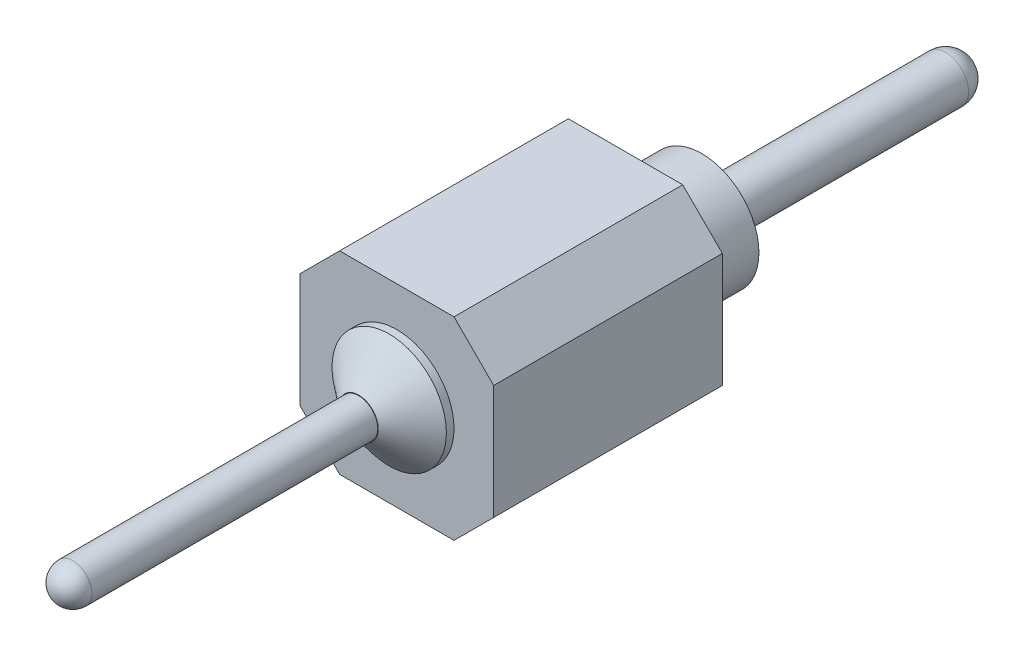
ISO-10303-21;
HEADER;
FILE_DESCRIPTION(('STEP AP214'),'2;1');
FILE_NAME('part.step','',(''),(''),'','','');
FILE_SCHEMA(('AUTOMOTIVE_DESIGN { 1 0 10303 214 1 1 1 1 }'));
ENDSEC;
DATA;
#1=APPLICATION_CONTEXT('core data for automotive mechanical design processes');
#2=APPLICATION_PROTOCOL_DEFINITION('international standard','automotive_design',2000,#1);
#3=PRODUCT_CONTEXT('',#1,'mechanical');
#4=PRODUCT('Part','Part','',(#3));
#5=PRODUCT_RELATED_PRODUCT_CATEGORY('part','',(#4));
#6=PRODUCT_DEFINITION_FORMATION('','',#4);
#7=PRODUCT_DEFINITION_CONTEXT('part definition',#1,'design');
#8=PRODUCT_DEFINITION('design','',#6,#7);
#9=PRODUCT_DEFINITION_SHAPE('','',#8);
#10=(LENGTH_UNIT() NAMED_UNIT(*) SI_UNIT(.MILLI.,.METRE.));
#11=(NAMED_UNIT(*) PLANE_ANGLE_UNIT() SI_UNIT($,.RADIAN.));
#12=(NAMED_UNIT(*) SI_UNIT($,.STERADIAN.) SOLID_ANGLE_UNIT());
#13=UNCERTAINTY_MEASURE_WITH_UNIT(LENGTH_MEASURE(1.E-05),#10,'distance_accuracy_value','');
#14=(GEOMETRIC_REPRESENTATION_CONTEXT(3) GLOBAL_UNCERTAINTY_ASSIGNED_CONTEXT((#13)) GLOBAL_UNIT_ASSIGNED_CONTEXT((#10,
#11,#12)) REPRESENTATION_CONTEXT('',''));
#15=CARTESIAN_POINT('',(0.,0.,0.));
#16=DIRECTION('',(0.,0.,1.));
#17=DIRECTION('',(1.,0.,0.));
#18=AXIS2_PLACEMENT_3D('',#15,#16,#17);
#19=CARTESIAN_POINT('',(0.,0.,-7.2));
#20=DIRECTION('',(0.,0.,-1.));
#21=DIRECTION('',(1.,0.,0.));
#22=AXIS2_PLACEMENT_3D('',#19,#20,#21);
#23=SPHERICAL_SURFACE('',#22,0.3);
#24=CARTESIAN_POINT('',(0.,0.,-7.2));
#25=DIRECTION('',(0.,1.,0.));
#26=DIRECTION('',(1.,0.,0.));
#27=AXIS2_PLACEMENT_3D('',#24,#25,#26);
#28=CIRCLE('',#27,0.3);
#29=CARTESIAN_POINT('',(0.3,0.,-7.2));
#30=VERTEX_POINT('',#29);
#31=CARTESIAN_POINT('',(0.,0.,-7.5));
#32=VERTEX_POINT('',#31);
#33=EDGE_CURVE('E10',#30,#32,#28,.T.);
#34=ORIENTED_EDGE('',*,*,#33,.F.);
#35=CARTESIAN_POINT('',(0.,0.,-7.2));
#36=DIRECTION('',(0.,0.,1.));
#37=DIRECTION('',(1.,0.,0.));
#38=AXIS2_PLACEMENT_3D('',#35,#36,#37);
#39=CIRCLE('',#38,0.3);
#40=EDGE_CURVE('E27',#30,#30,#39,.T.);
#41=ORIENTED_EDGE('',*,*,#40,.F.);
#42=ORIENTED_EDGE('',*,*,#33,.T.);
#43=EDGE_LOOP('',(#34,#41,#42));
#44=FACE_BOUND('',#43,.T.);
#45=ADVANCED_FACE('F16',(#44),#23,.T.);
#46=CARTESIAN_POINT('',(0.,0.,-4.));
#47=DIRECTION('',(0.,0.,1.));
#48=DIRECTION('',(1.,0.,0.));
#49=AXIS2_PLACEMENT_3D('',#46,#47,#48);
#50=CYLINDRICAL_SURFACE('',#49,0.3);
#51=DIRECTION('',(0.,0.,-1.));
#52=VECTOR('',#51,1.);
#53=CARTESIAN_POINT('',(0.3,0.,-4.));
#54=LINE('',#53,#52);
#55=CARTESIAN_POINT('',(0.3,0.,-4.));
#56=VERTEX_POINT('',#55);
#57=EDGE_CURVE('E229',#56,#30,#54,.T.);
#58=ORIENTED_EDGE('',*,*,#57,.T.);
#59=ORIENTED_EDGE('',*,*,#40,.T.);
#60=ORIENTED_EDGE('',*,*,#57,.F.);
#61=CARTESIAN_POINT('',(0.,0.,-4.));
#62=DIRECTION('',(0.,0.,1.));
#63=DIRECTION('',(1.,0.,0.));
#64=AXIS2_PLACEMENT_3D('',#61,#62,#63);
#65=CIRCLE('',#64,0.3);
#66=EDGE_CURVE('E233',#56,#56,#65,.T.);
#67=ORIENTED_EDGE('',*,*,#66,.F.);
#68=EDGE_LOOP('',(#58,#59,#60,#67));
#69=FACE_BOUND('',#68,.T.);
#70=ADVANCED_FACE('F387',(#69),#50,.T.);
#71=CARTESIAN_POINT('',(0.,0.,-4.));
#72=DIRECTION('',(0.,0.,1.));
#73=DIRECTION('',(1.,0.,0.));
#74=AXIS2_PLACEMENT_3D('',#71,#72,#73);
#75=PLANE('',#74);
#76=ORIENTED_EDGE('',*,*,#66,.T.);
#77=EDGE_LOOP('',(#76));
#78=FACE_BOUND('',#77,.T.);
#79=CARTESIAN_POINT('',(0.,0.,-4.));
#80=DIRECTION('',(0.,0.,1.));
#81=DIRECTION('',(1.,0.,0.));
#82=AXIS2_PLACEMENT_3D('',#79,#80,#81);
#83=CIRCLE('',#82,0.75);
#84=CARTESIAN_POINT('',(0.75,0.,-4.));
#85=VERTEX_POINT('',#84);
#86=EDGE_CURVE('E113',#85,#85,#83,.T.);
#87=ORIENTED_EDGE('',*,*,#86,.F.);
#88=EDGE_LOOP('',(#87));
#89=FACE_BOUND('',#88,.T.);
#90=ADVANCED_FACE('F392',(#78,#89),#75,.F.);
#91=CARTESIAN_POINT('',(0.,0.,-4.));
#92=DIRECTION('',(0.,0.,-1.));
#93=DIRECTION('',(1.,0.,0.));
#94=AXIS2_PLACEMENT_3D('',#91,#92,#93);
#95=CYLINDRICAL_SURFACE('',#94,0.75);
#96=DIRECTION('',(0.,0.,1.));
#97=VECTOR('',#96,1.);
#98=CARTESIAN_POINT('',(0.75,0.,-4.));
#99=LINE('',#98,#97);
#100=CARTESIAN_POINT('',(0.75,0.,-3.));
#101=VERTEX_POINT('',#100);
#102=EDGE_CURVE('E118',#85,#101,#99,.T.);
#103=ORIENTED_EDGE('',*,*,#102,.T.);
#104=CARTESIAN_POINT('',(0.,0.,-3.));
#105=DIRECTION('',(0.,0.,-1.));
#106=DIRECTION('',(1.,0.,0.));
#107=AXIS2_PLACEMENT_3D('',#104,#105,#106);
#108=CIRCLE('',#107,0.75);
#109=EDGE_CURVE('E185',#101,#101,#108,.T.);
#110=ORIENTED_EDGE('',*,*,#109,.T.);
#111=ORIENTED_EDGE('',*,*,#102,.F.);
#112=ORIENTED_EDGE('',*,*,#86,.T.);
#113=EDGE_LOOP('',(#103,#110,#111,#112));
#114=FACE_BOUND('',#113,.T.);
#115=ADVANCED_FACE('F406',(#114),#95,.T.);
#116=CARTESIAN_POINT('',(0.,0.,-3.));
#117=DIRECTION('',(0.,0.,1.));
#118=DIRECTION('',(1.,0.,0.));
#119=AXIS2_PLACEMENT_3D('',#116,#117,#118);
#120=PLANE('',#119);
#121=ORIENTED_EDGE('',*,*,#109,.F.);
#122=EDGE_LOOP('',(#121));
#123=FACE_BOUND('',#122,.T.);
#124=DIRECTION('',(-1.,0.,0.));
#125=VECTOR('',#124,1.);
#126=CARTESIAN_POINT('',(0.75,1.27,-3.));
#127=LINE('',#126,#125);
#128=CARTESIAN_POINT('',(0.75,1.27,-3.));
#129=VERTEX_POINT('',#128);
#130=CARTESIAN_POINT('',(-0.75,1.27,-3.));
#131=VERTEX_POINT('',#130);
#132=EDGE_CURVE('E203',#129,#131,#127,.T.);
#133=ORIENTED_EDGE('',*,*,#132,.F.);
#134=DIRECTION('',(-0.707106781186548,0.707106781186548,0.));
#135=VECTOR('',#134,1.);
#136=CARTESIAN_POINT('',(1.27,0.75,-3.));
#137=LINE('',#136,#135);
#138=CARTESIAN_POINT('',(1.27,0.75,-3.));
#139=VERTEX_POINT('',#138);
#140=EDGE_CURVE('E240',#139,#129,#137,.T.);
#141=ORIENTED_EDGE('',*,*,#140,.F.);
#142=DIRECTION('',(0.,1.,0.));
#143=VECTOR('',#142,1.);
#144=CARTESIAN_POINT('',(1.27,-0.75,-3.));
#145=LINE('',#144,#143);
#146=CARTESIAN_POINT('',(1.27,-0.75,-3.));
#147=VERTEX_POINT('',#146);
#148=EDGE_CURVE('E171',#147,#139,#145,.T.);
#149=ORIENTED_EDGE('',*,*,#148,.F.);
#150=DIRECTION('',(0.707106781186548,0.707106781186548,0.));
#151=VECTOR('',#150,1.);
#152=CARTESIAN_POINT('',(0.75,-1.27,-3.));
#153=LINE('',#152,#151);
#154=CARTESIAN_POINT('',(0.75,-1.27,-3.));
#155=VERTEX_POINT('',#154);
#156=EDGE_CURVE('E183',#155,#147,#153,.T.);
#157=ORIENTED_EDGE('',*,*,#156,.F.);
#158=DIRECTION('',(1.,0.,0.));
#159=VECTOR('',#158,1.);
#160=CARTESIAN_POINT('',(-0.75,-1.27,-3.));
#161=LINE('',#160,#159);
#162=CARTESIAN_POINT('',(-0.75,-1.27,-3.));
#163=VERTEX_POINT('',#162);
#164=EDGE_CURVE('E226',#163,#155,#161,.T.);
#165=ORIENTED_EDGE('',*,*,#164,.F.);
#166=DIRECTION('',(0.707106781186548,-0.707106781186548,0.));
#167=VECTOR('',#166,1.);
#168=CARTESIAN_POINT('',(-1.27,-0.75,-3.));
#169=LINE('',#168,#167);
#170=CARTESIAN_POINT('',(-1.27,-0.75,-3.));
#171=VERTEX_POINT('',#170);
#172=EDGE_CURVE('E236',#171,#163,#169,.T.);
#173=ORIENTED_EDGE('',*,*,#172,.F.);
#174=DIRECTION('',(0.,-1.,0.));
#175=VECTOR('',#174,1.);
#176=CARTESIAN_POINT('',(-1.27,0.75,-3.));
#177=LINE('',#176,#175);
#178=CARTESIAN_POINT('',(-1.27,0.75,-3.));
#179=VERTEX_POINT('',#178);
#180=EDGE_CURVE('E216',#179,#171,#177,.T.);
#181=ORIENTED_EDGE('',*,*,#180,.F.);
#182=DIRECTION('',(-0.707106781186548,-0.707106781186548,0.));
#183=VECTOR('',#182,1.);
#184=CARTESIAN_POINT('',(-0.75,1.27,-3.));
#185=LINE('',#184,#183);
#186=EDGE_CURVE('E215',#131,#179,#185,.T.);
#187=ORIENTED_EDGE('',*,*,#186,.F.);
#188=EDGE_LOOP('',(#133,#141,#149,#157,#165,#173,#181,#187));
#189=FACE_BOUND('',#188,.T.);
#190=ADVANCED_FACE('F265',(#123,#189),#120,.F.);
#191=CARTESIAN_POINT('',(0.75,-1.27,0.));
#192=DIRECTION('',(0.707106781186548,-0.707106781186548,0.));
#193=DIRECTION('',(0.,0.,-1.));
#194=AXIS2_PLACEMENT_3D('',#191,#192,#193);
#195=PLANE('',#194);
#196=DIRECTION('',(0.,0.,-1.));
#197=VECTOR('',#196,1.);
#198=CARTESIAN_POINT('',(0.75,-1.27,0.));
#199=LINE('',#198,#197);
#200=CARTESIAN_POINT('',(0.75,-1.27,0.));
#201=VERTEX_POINT('',#200);
#202=EDGE_CURVE('E186',#201,#155,#199,.T.);
#203=ORIENTED_EDGE('',*,*,#202,.T.);
#204=ORIENTED_EDGE('',*,*,#156,.T.);
#205=DIRECTION('',(0.,0.,-1.));
#206=VECTOR('',#205,1.);
#207=CARTESIAN_POINT('',(1.27,-0.75,0.));
#208=LINE('',#207,#206);
#209=CARTESIAN_POINT('',(1.27,-0.75,0.));
#210=VERTEX_POINT('',#209);
#211=EDGE_CURVE('E167',#210,#147,#208,.T.);
#212=ORIENTED_EDGE('',*,*,#211,.F.);
#213=DIRECTION('',(0.707106781186548,0.707106781186548,0.));
#214=VECTOR('',#213,1.);
#215=CARTESIAN_POINT('',(0.75,-1.27,0.));
#216=LINE('',#215,#214);
#217=EDGE_CURVE('E178',#201,#210,#216,.T.);
#218=ORIENTED_EDGE('',*,*,#217,.F.);
#219=EDGE_LOOP('',(#203,#204,#212,#218));
#220=FACE_BOUND('',#219,.T.);
#221=ADVANCED_FACE('F405',(#220),#195,.T.);
#222=CARTESIAN_POINT('',(-0.75,-1.27,0.));
#223=DIRECTION('',(0.,-1.,0.));
#224=DIRECTION('',(0.,0.,-1.));
#225=AXIS2_PLACEMENT_3D('',#222,#223,#224);
#226=PLANE('',#225);
#227=DIRECTION('',(0.,0.,-1.));
#228=VECTOR('',#227,1.);
#229=CARTESIAN_POINT('',(-0.75,-1.27,0.));
#230=LINE('',#229,#228);
#231=CARTESIAN_POINT('',(-0.75,-1.27,0.));
#232=VERTEX_POINT('',#231);
#233=EDGE_CURVE('E172',#232,#163,#230,.T.);
#234=ORIENTED_EDGE('',*,*,#233,.T.);
#235=ORIENTED_EDGE('',*,*,#164,.T.);
#236=ORIENTED_EDGE('',*,*,#202,.F.);
#237=DIRECTION('',(1.,0.,0.));
#238=VECTOR('',#237,1.);
#239=CARTESIAN_POINT('',(-0.75,-1.27,0.));
#240=LINE('',#239,#238);
#241=EDGE_CURVE('E182',#232,#201,#240,.T.);
#242=ORIENTED_EDGE('',*,*,#241,.F.);
#243=EDGE_LOOP('',(#234,#235,#236,#242));
#244=FACE_BOUND('',#243,.T.);
#245=ADVANCED_FACE('F256',(#244),#226,.T.);
#246=CARTESIAN_POINT('',(1.27,-0.75,0.));
#247=DIRECTION('',(1.,0.,0.));
#248=DIRECTION('',(0.,1.,0.));
#249=AXIS2_PLACEMENT_3D('',#246,#247,#248);
#250=PLANE('',#249);
#251=ORIENTED_EDGE('',*,*,#211,.T.);
#252=ORIENTED_EDGE('',*,*,#148,.T.);
#253=DIRECTION('',(0.,0.,-1.));
#254=VECTOR('',#253,1.);
#255=CARTESIAN_POINT('',(1.27,0.75,0.));
#256=LINE('',#255,#254);
#257=CARTESIAN_POINT('',(1.27,0.75,0.));
#258=VERTEX_POINT('',#257);
#259=EDGE_CURVE('E241',#258,#139,#256,.T.);
#260=ORIENTED_EDGE('',*,*,#259,.F.);
#261=DIRECTION('',(0.,1.,0.));
#262=VECTOR('',#261,1.);
#263=CARTESIAN_POINT('',(1.27,-0.75,0.));
#264=LINE('',#263,#262);
#265=EDGE_CURVE('E181',#210,#258,#264,.T.);
#266=ORIENTED_EDGE('',*,*,#265,.F.);
#267=EDGE_LOOP('',(#251,#252,#260,#266));
#268=FACE_BOUND('',#267,.T.);
#269=ADVANCED_FACE('F18',(#268),#250,.T.);
#270=CARTESIAN_POINT('',(-1.27,-0.75,0.));
#271=DIRECTION('',(-0.707106781186548,-0.707106781186548,0.));
#272=DIRECTION('',(-0.707106781186548,0.707106781186548,0.));
#273=AXIS2_PLACEMENT_3D('',#270,#271,#272);
#274=PLANE('',#273);
#275=DIRECTION('',(0.,0.,-1.));
#276=VECTOR('',#275,1.);
#277=CARTESIAN_POINT('',(-1.27,-0.75,0.));
#278=LINE('',#277,#276);
#279=CARTESIAN_POINT('',(-1.27,-0.75,0.));
#280=VERTEX_POINT('',#279);
#281=EDGE_CURVE('E220',#280,#171,#278,.T.);
#282=ORIENTED_EDGE('',*,*,#281,.T.);
#283=ORIENTED_EDGE('',*,*,#172,.T.);
#284=ORIENTED_EDGE('',*,*,#233,.F.);
#285=DIRECTION('',(0.707106781186548,-0.707106781186548,0.));
#286=VECTOR('',#285,1.);
#287=CARTESIAN_POINT('',(-1.27,-0.75,0.));
#288=LINE('',#287,#286);
#289=EDGE_CURVE('E199',#280,#232,#288,.T.);
#290=ORIENTED_EDGE('',*,*,#289,.F.);
#291=EDGE_LOOP('',(#282,#283,#284,#290));
#292=FACE_BOUND('',#291,.T.);
#293=ADVANCED_FACE('F262',(#292),#274,.T.);
#294=CARTESIAN_POINT('',(1.27,0.75,0.));
#295=DIRECTION('',(0.707106781186548,0.707106781186548,0.));
#296=DIRECTION('',(0.,0.,-1.));
#297=AXIS2_PLACEMENT_3D('',#294,#295,#296);
#298=PLANE('',#297);
#299=ORIENTED_EDGE('',*,*,#259,.T.);
#300=ORIENTED_EDGE('',*,*,#140,.T.);
#301=DIRECTION('',(0.,0.,-1.));
#302=VECTOR('',#301,1.);
#303=CARTESIAN_POINT('',(0.75,1.27,0.));
#304=LINE('',#303,#302);
#305=CARTESIAN_POINT('',(0.75,1.27,0.));
#306=VERTEX_POINT('',#305);
#307=EDGE_CURVE('E200',#306,#129,#304,.T.);
#308=ORIENTED_EDGE('',*,*,#307,.F.);
#309=DIRECTION('',(-0.707106781186548,0.707106781186548,0.));
#310=VECTOR('',#309,1.);
#311=CARTESIAN_POINT('',(1.27,0.75,0.));
#312=LINE('',#311,#310);
#313=EDGE_CURVE('E211',#258,#306,#312,.T.);
#314=ORIENTED_EDGE('',*,*,#313,.F.);
#315=EDGE_LOOP('',(#299,#300,#308,#314));
#316=FACE_BOUND('',#315,.T.);
#317=ADVANCED_FACE('F455',(#316),#298,.T.);
#318=CARTESIAN_POINT('',(-1.27,0.75,0.));
#319=DIRECTION('',(-1.,0.,0.));
#320=DIRECTION('',(0.,0.,1.));
#321=AXIS2_PLACEMENT_3D('',#318,#319,#320);
#322=PLANE('',#321);
#323=DIRECTION('',(0.,0.,-1.));
#324=VECTOR('',#323,1.);
#325=CARTESIAN_POINT('',(-1.27,0.75,0.));
#326=LINE('',#325,#324);
#327=CARTESIAN_POINT('',(-1.27,0.75,0.));
#328=VERTEX_POINT('',#327);
#329=EDGE_CURVE('E204',#328,#179,#326,.T.);
#330=ORIENTED_EDGE('',*,*,#329,.T.);
#331=ORIENTED_EDGE('',*,*,#180,.T.);
#332=ORIENTED_EDGE('',*,*,#281,.F.);
#333=DIRECTION('',(0.,-1.,0.));
#334=VECTOR('',#333,1.);
#335=CARTESIAN_POINT('',(-1.27,0.75,0.));
#336=LINE('',#335,#334);
#337=EDGE_CURVE('E160',#328,#280,#336,.T.);
#338=ORIENTED_EDGE('',*,*,#337,.F.);
#339=EDGE_LOOP('',(#330,#331,#332,#338));
#340=FACE_BOUND('',#339,.T.);
#341=ADVANCED_FACE('F465',(#340),#322,.T.);
#342=CARTESIAN_POINT('',(0.75,1.27,0.));
#343=DIRECTION('',(0.,1.,0.));
#344=DIRECTION('',(1.,0.,0.));
#345=AXIS2_PLACEMENT_3D('',#342,#343,#344);
#346=PLANE('',#345);
#347=ORIENTED_EDGE('',*,*,#307,.T.);
#348=ORIENTED_EDGE('',*,*,#132,.T.);
#349=DIRECTION('',(0.,0.,-1.));
#350=VECTOR('',#349,1.);
#351=CARTESIAN_POINT('',(-0.75,1.27,0.));
#352=LINE('',#351,#350);
#353=CARTESIAN_POINT('',(-0.75,1.27,0.));
#354=VERTEX_POINT('',#353);
#355=EDGE_CURVE('E210',#354,#131,#352,.T.);
#356=ORIENTED_EDGE('',*,*,#355,.F.);
#357=DIRECTION('',(-1.,0.,0.));
#358=VECTOR('',#357,1.);
#359=CARTESIAN_POINT('',(0.75,1.27,0.));
#360=LINE('',#359,#358);
#361=EDGE_CURVE('E206',#306,#354,#360,.T.);
#362=ORIENTED_EDGE('',*,*,#361,.F.);
#363=EDGE_LOOP('',(#347,#348,#356,#362));
#364=FACE_BOUND('',#363,.T.);
#365=ADVANCED_FACE('F490',(#364),#346,.T.);
#366=CARTESIAN_POINT('',(-0.75,1.27,0.));
#367=DIRECTION('',(-0.707106781186548,0.707106781186548,0.));
#368=DIRECTION('',(0.,0.,1.));
#369=AXIS2_PLACEMENT_3D('',#366,#367,#368);
#370=PLANE('',#369);
#371=ORIENTED_EDGE('',*,*,#355,.T.);
#372=ORIENTED_EDGE('',*,*,#186,.T.);
#373=ORIENTED_EDGE('',*,*,#329,.F.);
#374=DIRECTION('',(-0.707106781186548,-0.707106781186548,0.));
#375=VECTOR('',#374,1.);
#376=CARTESIAN_POINT('',(-0.75,1.27,0.));
#377=LINE('',#376,#375);
#378=EDGE_CURVE('E151',#354,#328,#377,.T.);
#379=ORIENTED_EDGE('',*,*,#378,.F.);
#380=EDGE_LOOP('',(#371,#372,#373,#379));
#381=FACE_BOUND('',#380,.T.);
#382=ADVANCED_FACE('F443',(#381),#370,.T.);
#383=CARTESIAN_POINT('',(0.,0.,0.));
#384=DIRECTION('',(0.,0.,1.));
#385=DIRECTION('',(1.,0.,0.));
#386=AXIS2_PLACEMENT_3D('',#383,#384,#385);
#387=PLANE('',#386);
#388=CARTESIAN_POINT('',(0.,0.,0.));
#389=DIRECTION('',(0.,0.,-1.));
#390=DIRECTION('',(1.,0.,0.));
#391=AXIS2_PLACEMENT_3D('',#388,#389,#390);
#392=CIRCLE('',#391,0.75);
#393=CARTESIAN_POINT('',(0.75,0.,0.));
#394=VERTEX_POINT('',#393);
#395=EDGE_CURVE('E152',#394,#394,#392,.T.);
#396=ORIENTED_EDGE('',*,*,#395,.T.);
#397=EDGE_LOOP('',(#396));
#398=FACE_BOUND('',#397,.T.);
#399=ORIENTED_EDGE('',*,*,#378,.T.);
#400=ORIENTED_EDGE('',*,*,#337,.T.);
#401=ORIENTED_EDGE('',*,*,#289,.T.);
#402=ORIENTED_EDGE('',*,*,#241,.T.);
#403=ORIENTED_EDGE('',*,*,#217,.T.);
#404=ORIENTED_EDGE('',*,*,#265,.T.);
#405=ORIENTED_EDGE('',*,*,#313,.T.);
#406=ORIENTED_EDGE('',*,*,#361,.T.);
#407=EDGE_LOOP('',(#399,#400,#401,#402,#403,#404,#405,#406));
#408=FACE_BOUND('',#407,.T.);
#409=ADVANCED_FACE('F438',(#398,#408),#387,.T.);
#410=CARTESIAN_POINT('',(0.,0.,4.25));
#411=DIRECTION('',(0.,0.,1.));
#412=DIRECTION('',(1.,0.,0.));
#413=AXIS2_PLACEMENT_3D('',#410,#411,#412);
#414=SPHERICAL_SURFACE('',#413,0.25);
#415=CARTESIAN_POINT('',(0.,0.,4.25));
#416=DIRECTION('',(0.,-1.,0.));
#417=DIRECTION('',(1.,0.,0.));
#418=AXIS2_PLACEMENT_3D('',#415,#416,#417);
#419=CIRCLE('',#418,0.25);
#420=CARTESIAN_POINT('',(0.25,0.,4.25));
#421=VERTEX_POINT('',#420);
#422=CARTESIAN_POINT('',(0.,0.,4.5));
#423=VERTEX_POINT('',#422);
#424=EDGE_CURVE('E146',#421,#423,#419,.T.);
#425=ORIENTED_EDGE('',*,*,#424,.F.);
#426=CARTESIAN_POINT('',(0.,0.,4.25));
#427=DIRECTION('',(0.,0.,1.));
#428=DIRECTION('',(1.,0.,0.));
#429=AXIS2_PLACEMENT_3D('',#426,#427,#428);
#430=CIRCLE('',#429,0.25);
#431=EDGE_CURVE('E149',#421,#421,#430,.T.);
#432=ORIENTED_EDGE('',*,*,#431,.T.);
#433=ORIENTED_EDGE('',*,*,#424,.T.);
#434=EDGE_LOOP('',(#425,#432,#433));
#435=FACE_BOUND('',#434,.T.);
#436=ADVANCED_FACE('F147',(#435),#414,.T.);
#437=CARTESIAN_POINT('',(0.,0.,-4.));
#438=DIRECTION('',(0.,0.,-1.));
#439=DIRECTION('',(1.,0.,0.));
#440=AXIS2_PLACEMENT_3D('',#437,#438,#439);
#441=CYLINDRICAL_SURFACE('',#440,0.75);
#442=CARTESIAN_POINT('',(0.,0.,0.1));
#443=DIRECTION('',(0.,0.,1.));
#444=DIRECTION('',(1.,0.,0.));
#445=AXIS2_PLACEMENT_3D('',#442,#443,#444);
#446=CIRCLE('',#445,0.75);
#447=CARTESIAN_POINT('',(0.75,0.,0.1));
#448=VERTEX_POINT('',#447);
#449=EDGE_CURVE('E177',#448,#448,#446,.T.);
#450=ORIENTED_EDGE('',*,*,#449,.F.);
#451=DIRECTION('',(0.,0.,1.));
#452=VECTOR('',#451,1.);
#453=CARTESIAN_POINT('',(0.75,0.,-4.));
#454=LINE('',#453,#452);
#455=EDGE_CURVE('E163',#394,#448,#454,.T.);
#456=ORIENTED_EDGE('',*,*,#455,.F.);
#457=ORIENTED_EDGE('',*,*,#395,.F.);
#458=ORIENTED_EDGE('',*,*,#455,.T.);
#459=EDGE_LOOP('',(#450,#456,#457,#458));
#460=FACE_BOUND('',#459,.T.);
#461=ADVANCED_FACE('F431',(#460),#441,.T.);
#462=CARTESIAN_POINT('',(0.,0.,0.5));
#463=DIRECTION('',(0.,0.,-1.));
#464=DIRECTION('',(1.,0.,0.));
#465=AXIS2_PLACEMENT_3D('',#462,#463,#464);
#466=CYLINDRICAL_SURFACE('',#465,0.25);
#467=CARTESIAN_POINT('',(0.,0.,0.5));
#468=DIRECTION('',(0.,0.,1.));
#469=DIRECTION('',(1.,0.,0.));
#470=AXIS2_PLACEMENT_3D('',#467,#468,#469);
#471=CIRCLE('',#470,0.25);
#472=CARTESIAN_POINT('',(0.25,0.,0.5));
#473=VERTEX_POINT('',#472);
#474=EDGE_CURVE('E187',#473,#473,#471,.T.);
#475=ORIENTED_EDGE('',*,*,#474,.T.);
#476=DIRECTION('',(0.,0.,1.));
#477=VECTOR('',#476,1.);
#478=CARTESIAN_POINT('',(0.25,0.,0.5));
#479=LINE('',#478,#477);
#480=EDGE_CURVE('E173',#473,#421,#479,.T.);
#481=ORIENTED_EDGE('',*,*,#480,.T.);
#482=ORIENTED_EDGE('',*,*,#431,.F.);
#483=ORIENTED_EDGE('',*,*,#480,.F.);
#484=EDGE_LOOP('',(#475,#481,#482,#483));
#485=FACE_BOUND('',#484,.T.);
#486=ADVANCED_FACE('F420',(#485),#466,.T.);
#487=CARTESIAN_POINT('',(0.,0.,0.1));
#488=DIRECTION('',(0.,0.,-1.));
#489=DIRECTION('',(1.,0.,0.));
#490=AXIS2_PLACEMENT_3D('',#487,#488,#489);
#491=CONICAL_SURFACE('',#490,0.75,0.890117918517);
#492=DIRECTION('',(-0.777145961456903,0.,0.629320391049922));
#493=VECTOR('',#492,1.);
#494=CARTESIAN_POINT('',(0.75,0.,0.1));
#495=LINE('',#494,#493);
#496=CARTESIAN_POINT('',(0.256041137386,0.,0.5));
#497=VERTEX_POINT('',#496);
#498=EDGE_CURVE('E191',#448,#497,#495,.T.);
#499=ORIENTED_EDGE('',*,*,#498,.F.);
#500=ORIENTED_EDGE('',*,*,#449,.T.);
#501=ORIENTED_EDGE('',*,*,#498,.T.);
#502=CARTESIAN_POINT('',(0.,0.,0.5));
#503=DIRECTION('',(0.,0.,1.));
#504=DIRECTION('',(1.,0.,0.));
#505=AXIS2_PLACEMENT_3D('',#502,#503,#504);
#506=CIRCLE('',#505,0.256041137386);
#507=EDGE_CURVE('E20',#497,#497,#506,.T.);
#508=ORIENTED_EDGE('',*,*,#507,.F.);
#509=EDGE_LOOP('',(#499,#500,#501,#508));
#510=FACE_BOUND('',#509,.T.);
#511=ADVANCED_FACE('F414',(#510),#491,.T.);
#512=CARTESIAN_POINT('',(0.,0.,0.5));
#513=DIRECTION('',(0.,0.,1.));
#514=DIRECTION('',(1.,0.,0.));
#515=AXIS2_PLACEMENT_3D('',#512,#513,#514);
#516=PLANE('',#515);
#517=ORIENTED_EDGE('',*,*,#474,.F.);
#518=EDGE_LOOP('',(#517));
#519=FACE_BOUND('',#518,.T.);
#520=ORIENTED_EDGE('',*,*,#507,.T.);
#521=EDGE_LOOP('',(#520));
#522=FACE_BOUND('',#521,.T.);
#523=ADVANCED_FACE('F419',(#519,#522),#516,.T.);
#524=CLOSED_SHELL('',(#45,#70,#90,#115,#190,#221,#245,#269,#293,#317,#341,#365,#382,#409,#436,
#461,#486,#511,#523));
#525=MANIFOLD_SOLID_BREP('B1',#524);
#526=ADVANCED_BREP_SHAPE_REPRESENTATION('',(#18,#525),#14);
#527=SHAPE_DEFINITION_REPRESENTATION(#9,#526);
ENDSEC;
END-ISO-10303-21;
